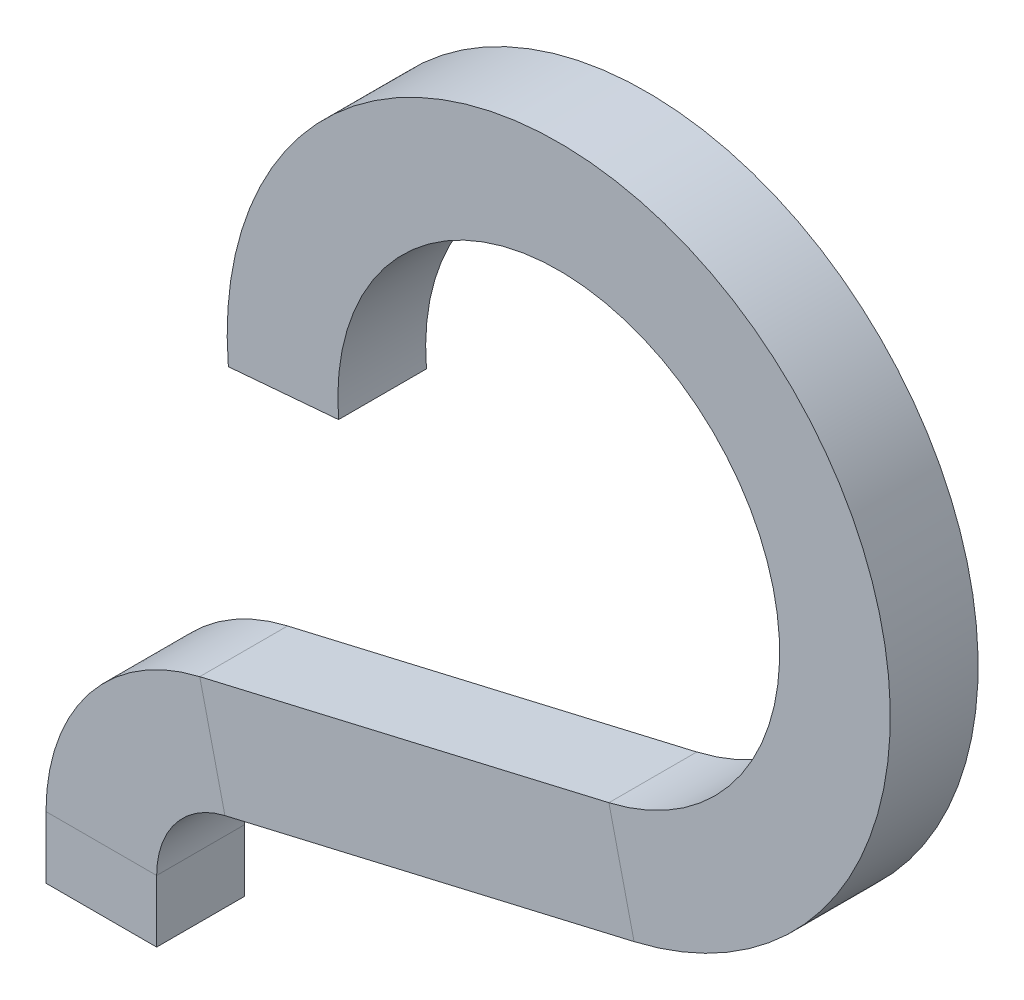
ISO-10303-21;
HEADER;
FILE_DESCRIPTION(('STEP AP214'),'2;1');
FILE_NAME('part.step','',(''),(''),'','','');
FILE_SCHEMA(('AUTOMOTIVE_DESIGN { 1 0 10303 214 1 1 1 1 }'));
ENDSEC;
DATA;
#1=APPLICATION_CONTEXT('core data for automotive mechanical design processes');
#2=APPLICATION_PROTOCOL_DEFINITION('international standard','automotive_design',2000,#1);
#3=PRODUCT_CONTEXT('',#1,'mechanical');
#4=PRODUCT('Part','Part','',(#3));
#5=PRODUCT_RELATED_PRODUCT_CATEGORY('part','',(#4));
#6=PRODUCT_DEFINITION_FORMATION('','',#4);
#7=PRODUCT_DEFINITION_CONTEXT('part definition',#1,'design');
#8=PRODUCT_DEFINITION('design','',#6,#7);
#9=PRODUCT_DEFINITION_SHAPE('','',#8);
#10=(LENGTH_UNIT() NAMED_UNIT(*) SI_UNIT(.MILLI.,.METRE.));
#11=(NAMED_UNIT(*) PLANE_ANGLE_UNIT() SI_UNIT($,.RADIAN.));
#12=(NAMED_UNIT(*) SI_UNIT($,.STERADIAN.) SOLID_ANGLE_UNIT());
#13=UNCERTAINTY_MEASURE_WITH_UNIT(LENGTH_MEASURE(1.E-05),#10,'distance_accuracy_value','');
#14=(GEOMETRIC_REPRESENTATION_CONTEXT(3) GLOBAL_UNCERTAINTY_ASSIGNED_CONTEXT((#13)) GLOBAL_UNIT_ASSIGNED_CONTEXT((#10,
#11,#12)) REPRESENTATION_CONTEXT('',''));
#15=CARTESIAN_POINT('',(0.,0.,0.));
#16=DIRECTION('',(0.,0.,1.));
#17=DIRECTION('',(1.,0.,0.));
#18=AXIS2_PLACEMENT_3D('',#15,#16,#17);
#19=CARTESIAN_POINT('',(-14.4458437154451,20.5388431687247,-14.1552166569552));
#20=DIRECTION('',(0.,0.,1.));
#21=DIRECTION('',(1.,0.,0.));
#22=AXIS2_PLACEMENT_3D('',#19,#20,#21);
#23=PLANE('',#22);
#24=DIRECTION('',(-1.,0.,0.));
#25=VECTOR('',#24,1.);
#26=CARTESIAN_POINT('',(-14.4458437154451,20.5388431687247,-14.1552166569552));
#27=LINE('',#26,#25);
#28=CARTESIAN_POINT('',(22.1689833705459,20.5388431687242,-14.1552166569552));
#29=VERTEX_POINT('',#28);
#30=CARTESIAN_POINT('',(-14.4458437154451,20.5388431687247,-14.1552166569552));
#31=VERTEX_POINT('',#30);
#32=EDGE_CURVE('E189',#29,#31,#27,.T.);
#33=ORIENTED_EDGE('',*,*,#32,.F.);
#34=DIRECTION('',(0.,-1.,0.));
#35=VECTOR('',#34,1.);
#36=CARTESIAN_POINT('',(22.1689833705459,20.5388431687242,-14.1552166569552));
#37=LINE('',#36,#35);
#38=CARTESIAN_POINT('',(22.1689833705459,-1.5404344466674E-12,-14.1552166569552));
#39=VERTEX_POINT('',#38);
#40=EDGE_CURVE('E42',#29,#39,#37,.T.);
#41=ORIENTED_EDGE('',*,*,#40,.T.);
#42=DIRECTION('',(-1.,0.,0.));
#43=VECTOR('',#42,1.);
#44=CARTESIAN_POINT('',(-14.4458437154451,-1.03389519168218E-12,-14.1552166569552));
#45=LINE('',#44,#43);
#46=CARTESIAN_POINT('',(-14.4458437154451,-1.03389519168218E-12,-14.1552166569552));
#47=VERTEX_POINT('',#46);
#48=EDGE_CURVE('E49',#39,#47,#45,.T.);
#49=ORIENTED_EDGE('',*,*,#48,.T.);
#50=DIRECTION('',(0.,-1.,0.));
#51=VECTOR('',#50,1.);
#52=CARTESIAN_POINT('',(-14.4458437154451,20.5388431687247,-14.1552166569552));
#53=LINE('',#52,#51);
#54=EDGE_CURVE('E11',#31,#47,#53,.T.);
#55=ORIENTED_EDGE('',*,*,#54,.F.);
#56=EDGE_LOOP('',(#33,#41,#49,#55));
#57=FACE_BOUND('',#56,.T.);
#58=ADVANCED_FACE('F35',(#57),#23,.F.);
#59=CARTESIAN_POINT('',(22.1689833705459,20.5388431687242,-14.1552166569552));
#60=DIRECTION('',(-1.,0.,0.));
#61=DIRECTION('',(0.,0.,1.));
#62=AXIS2_PLACEMENT_3D('',#59,#60,#61);
#63=PLANE('',#62);
#64=DIRECTION('',(0.,0.,-1.));
#65=VECTOR('',#64,1.);
#66=CARTESIAN_POINT('',(22.1689833705459,20.5388431687242,-14.1552166569552));
#67=LINE('',#66,#65);
#68=CARTESIAN_POINT('',(22.1689833705459,20.5388431687242,14.9101615453267));
#69=VERTEX_POINT('',#68);
#70=EDGE_CURVE('E186',#69,#29,#67,.T.);
#71=ORIENTED_EDGE('',*,*,#70,.F.);
#72=DIRECTION('',(0.,-1.,0.));
#73=VECTOR('',#72,1.);
#74=CARTESIAN_POINT('',(22.1689833705459,20.5388431687242,14.9101615453267));
#75=LINE('',#74,#73);
#76=CARTESIAN_POINT('',(22.1689833705459,-1.5404344466674E-12,14.9101615453267));
#77=VERTEX_POINT('',#76);
#78=EDGE_CURVE('E213',#69,#77,#75,.T.);
#79=ORIENTED_EDGE('',*,*,#78,.T.);
#80=DIRECTION('',(0.,0.,-1.));
#81=VECTOR('',#80,1.);
#82=CARTESIAN_POINT('',(22.1689833705459,-1.5404344466674E-12,-14.1552166569552));
#83=LINE('',#82,#81);
#84=EDGE_CURVE('E57',#77,#39,#83,.T.);
#85=ORIENTED_EDGE('',*,*,#84,.T.);
#86=ORIENTED_EDGE('',*,*,#40,.F.);
#87=EDGE_LOOP('',(#71,#79,#85,#86));
#88=FACE_BOUND('',#87,.T.);
#89=ADVANCED_FACE('F216',(#88),#63,.F.);
#90=CARTESIAN_POINT('',(-14.4458437154451,20.5388431687247,14.9101615453267));
#91=DIRECTION('',(0.,0.,-1.));
#92=DIRECTION('',(-1.,0.,0.));
#93=AXIS2_PLACEMENT_3D('',#90,#91,#92);
#94=PLANE('',#93);
#95=DIRECTION('',(1.,0.,0.));
#96=VECTOR('',#95,1.);
#97=CARTESIAN_POINT('',(-14.4458437154451,20.5388431687247,14.9101615453267));
#98=LINE('',#97,#96);
#99=CARTESIAN_POINT('',(-14.4458437154451,20.5388431687247,14.9101615453267));
#100=VERTEX_POINT('',#99);
#101=EDGE_CURVE('E183',#100,#69,#98,.T.);
#102=ORIENTED_EDGE('',*,*,#101,.F.);
#103=DIRECTION('',(0.,-1.,0.));
#104=VECTOR('',#103,1.);
#105=CARTESIAN_POINT('',(-14.4458437154451,20.5388431687247,14.9101615453267));
#106=LINE('',#105,#104);
#107=CARTESIAN_POINT('',(-14.4458437154451,-1.03389519168218E-12,14.9101615453267));
#108=VERTEX_POINT('',#107);
#109=EDGE_CURVE('E210',#100,#108,#106,.T.);
#110=ORIENTED_EDGE('',*,*,#109,.T.);
#111=DIRECTION('',(1.,0.,0.));
#112=VECTOR('',#111,1.);
#113=CARTESIAN_POINT('',(-14.4458437154451,-1.03389519168218E-12,14.9101615453267));
#114=LINE('',#113,#112);
#115=EDGE_CURVE('E206',#108,#77,#114,.T.);
#116=ORIENTED_EDGE('',*,*,#115,.T.);
#117=ORIENTED_EDGE('',*,*,#78,.F.);
#118=EDGE_LOOP('',(#102,#110,#116,#117));
#119=FACE_BOUND('',#118,.T.);
#120=ADVANCED_FACE('F257',(#119),#94,.F.);
#121=CARTESIAN_POINT('',(-14.4458437154451,20.5388431687247,-14.1552166569552));
#122=DIRECTION('',(1.,0.,0.));
#123=DIRECTION('',(0.,0.,-1.));
#124=AXIS2_PLACEMENT_3D('',#121,#122,#123);
#125=PLANE('',#124);
#126=DIRECTION('',(0.,0.,1.));
#127=VECTOR('',#126,1.);
#128=CARTESIAN_POINT('',(-14.4458437154451,20.5388431687247,-14.1552166569552));
#129=LINE('',#128,#127);
#130=EDGE_CURVE('E180',#31,#100,#129,.T.);
#131=ORIENTED_EDGE('',*,*,#130,.F.);
#132=ORIENTED_EDGE('',*,*,#54,.T.);
#133=DIRECTION('',(0.,0.,1.));
#134=VECTOR('',#133,1.);
#135=CARTESIAN_POINT('',(-14.4458437154451,-1.03389519168218E-12,-14.1552166569552));
#136=LINE('',#135,#134);
#137=EDGE_CURVE('E204',#47,#108,#136,.T.);
#138=ORIENTED_EDGE('',*,*,#137,.T.);
#139=ORIENTED_EDGE('',*,*,#109,.F.);
#140=EDGE_LOOP('',(#131,#132,#138,#139));
#141=FACE_BOUND('',#140,.T.);
#142=ADVANCED_FACE('F247',(#141),#125,.F.);
#143=CARTESIAN_POINT('',(36.4419185296101,84.6587679085149,-14.1552166569552));
#144=DIRECTION('',(0.,0.,1.));
#145=DIRECTION('',(1.,0.,0.));
#146=AXIS2_PLACEMENT_3D('',#143,#144,#145);
#147=PLANE('',#146);
#148=DIRECTION('',(-0.227102895846886,0.973870768992457,0.));
#149=VECTOR('',#148,1.);
#150=CARTESIAN_POINT('',(36.4419185296101,84.6587679085149,-14.1552166569552));
#151=LINE('',#150,#149);
#152=CARTESIAN_POINT('',(44.7572517917716,49.0006580977551,-14.1552166569552));
#153=VERTEX_POINT('',#152);
#154=CARTESIAN_POINT('',(36.4419185296101,84.6587679085149,-14.1552166569552));
#155=VERTEX_POINT('',#154);
#156=EDGE_CURVE('E165',#153,#155,#151,.T.);
#157=ORIENTED_EDGE('',*,*,#156,.F.);
#158=CARTESIAN_POINT('',(51.3944369268485,20.5388431687257,-14.1552166569552));
#159=DIRECTION('',(0.,0.,1.));
#160=DIRECTION('',(1.,0.,0.));
#161=AXIS2_PLACEMENT_3D('',#158,#159,#160);
#162=CIRCLE('',#161,29.2254535563026);
#163=EDGE_CURVE('E198',#153,#29,#162,.T.);
#164=ORIENTED_EDGE('',*,*,#163,.T.);
#165=ORIENTED_EDGE('',*,*,#32,.T.);
#166=CARTESIAN_POINT('',(51.3944369268485,20.5388431687257,-14.1552166569552));
#167=DIRECTION('',(0.,0.,1.));
#168=DIRECTION('',(1.,0.,0.));
#169=AXIS2_PLACEMENT_3D('',#166,#167,#168);
#170=CIRCLE('',#169,65.8402806422936);
#171=EDGE_CURVE('E201',#155,#31,#170,.T.);
#172=ORIENTED_EDGE('',*,*,#171,.F.);
#173=EDGE_LOOP('',(#157,#164,#165,#172));
#174=FACE_BOUND('',#173,.T.);
#175=ADVANCED_FACE('F249',(#174),#147,.F.);
#176=CARTESIAN_POINT('',(51.3944369268485,20.5388431687257,0.));
#177=DIRECTION('',(0.,0.,1.));
#178=DIRECTION('',(1.,0.,0.));
#179=AXIS2_PLACEMENT_3D('',#176,#177,#178);
#180=CYLINDRICAL_SURFACE('',#179,29.2254535563026);
#181=DIRECTION('',(0.,0.,-1.));
#182=VECTOR('',#181,1.);
#183=CARTESIAN_POINT('',(44.7572517917716,49.0006580977551,-14.1552166569552));
#184=LINE('',#183,#182);
#185=CARTESIAN_POINT('',(44.7572517917716,49.0006580977551,14.9101615453267));
#186=VERTEX_POINT('',#185);
#187=EDGE_CURVE('E162',#186,#153,#184,.T.);
#188=ORIENTED_EDGE('',*,*,#187,.F.);
#189=CARTESIAN_POINT('',(51.3944369268485,20.5388431687257,14.9101615453267));
#190=DIRECTION('',(0.,0.,1.));
#191=DIRECTION('',(1.,0.,0.));
#192=AXIS2_PLACEMENT_3D('',#189,#190,#191);
#193=CIRCLE('',#192,29.2254535563026);
#194=EDGE_CURVE('E195',#186,#69,#193,.T.);
#195=ORIENTED_EDGE('',*,*,#194,.T.);
#196=ORIENTED_EDGE('',*,*,#70,.T.);
#197=ORIENTED_EDGE('',*,*,#163,.F.);
#198=EDGE_LOOP('',(#188,#195,#196,#197));
#199=FACE_BOUND('',#198,.T.);
#200=ADVANCED_FACE('F224',(#199),#180,.F.);
#201=CARTESIAN_POINT('',(36.4419185296101,84.6587679085149,14.9101615453267));
#202=DIRECTION('',(0.,0.,-1.));
#203=DIRECTION('',(-1.,0.,0.));
#204=AXIS2_PLACEMENT_3D('',#201,#202,#203);
#205=PLANE('',#204);
#206=DIRECTION('',(0.227102895846886,-0.973870768992457,0.));
#207=VECTOR('',#206,1.);
#208=CARTESIAN_POINT('',(36.4419185296101,84.6587679085149,14.9101615453267));
#209=LINE('',#208,#207);
#210=CARTESIAN_POINT('',(36.4419185296101,84.6587679085149,14.9101615453267));
#211=VERTEX_POINT('',#210);
#212=EDGE_CURVE('E159',#211,#186,#209,.T.);
#213=ORIENTED_EDGE('',*,*,#212,.F.);
#214=CARTESIAN_POINT('',(51.3944369268485,20.5388431687257,14.9101615453267));
#215=DIRECTION('',(0.,0.,1.));
#216=DIRECTION('',(1.,0.,0.));
#217=AXIS2_PLACEMENT_3D('',#214,#215,#216);
#218=CIRCLE('',#217,65.8402806422936);
#219=EDGE_CURVE('E192',#211,#100,#218,.T.);
#220=ORIENTED_EDGE('',*,*,#219,.T.);
#221=ORIENTED_EDGE('',*,*,#101,.T.);
#222=ORIENTED_EDGE('',*,*,#194,.F.);
#223=EDGE_LOOP('',(#213,#220,#221,#222));
#224=FACE_BOUND('',#223,.T.);
#225=ADVANCED_FACE('F221',(#224),#205,.F.);
#226=CARTESIAN_POINT('',(51.3944369268485,20.5388431687257,0.));
#227=DIRECTION('',(0.,0.,1.));
#228=DIRECTION('',(1.,0.,0.));
#229=AXIS2_PLACEMENT_3D('',#226,#227,#228);
#230=CYLINDRICAL_SURFACE('',#229,65.8402806422936);
#231=DIRECTION('',(0.,0.,1.));
#232=VECTOR('',#231,1.);
#233=CARTESIAN_POINT('',(36.4419185296101,84.6587679085149,-14.1552166569552));
#234=LINE('',#233,#232);
#235=EDGE_CURVE('E124',#155,#211,#234,.T.);
#236=ORIENTED_EDGE('',*,*,#235,.F.);
#237=ORIENTED_EDGE('',*,*,#171,.T.);
#238=ORIENTED_EDGE('',*,*,#130,.T.);
#239=ORIENTED_EDGE('',*,*,#219,.F.);
#240=EDGE_LOOP('',(#236,#237,#238,#239));
#241=FACE_BOUND('',#240,.T.);
#242=ADVANCED_FACE('F244',(#241),#230,.T.);
#243=CARTESIAN_POINT('',(171.845234240797,116.234297315868,-14.1552166569552));
#244=DIRECTION('',(0.,0.,1.));
#245=DIRECTION('',(1.,0.,0.));
#246=AXIS2_PLACEMENT_3D('',#243,#244,#245);
#247=PLANE('',#246);
#248=DIRECTION('',(-0.227102895846886,0.973870768992457,0.));
#249=VECTOR('',#248,1.);
#250=CARTESIAN_POINT('',(171.845234240797,116.234297315868,-14.1552166569552));
#251=LINE('',#250,#249);
#252=CARTESIAN_POINT('',(180.160567502959,80.576187505108,-14.1552166569552));
#253=VERTEX_POINT('',#252);
#254=CARTESIAN_POINT('',(171.845234240797,116.234297315868,-14.1552166569552));
#255=VERTEX_POINT('',#254);
#256=EDGE_CURVE('E149',#253,#255,#251,.T.);
#257=ORIENTED_EDGE('',*,*,#256,.F.);
#258=DIRECTION('',(-0.973870768992453,-0.2271028958469,0.));
#259=VECTOR('',#258,1.);
#260=CARTESIAN_POINT('',(180.160567502959,80.576187505108,-14.1552166569552));
#261=LINE('',#260,#259);
#262=EDGE_CURVE('E174',#253,#153,#261,.T.);
#263=ORIENTED_EDGE('',*,*,#262,.T.);
#264=ORIENTED_EDGE('',*,*,#156,.T.);
#265=DIRECTION('',(-0.973870768992453,-0.2271028958469,0.));
#266=VECTOR('',#265,1.);
#267=CARTESIAN_POINT('',(171.845234240797,116.234297315868,-14.1552166569552));
#268=LINE('',#267,#266);
#269=EDGE_CURVE('E177',#255,#155,#268,.T.);
#270=ORIENTED_EDGE('',*,*,#269,.F.);
#271=EDGE_LOOP('',(#257,#263,#264,#270));
#272=FACE_BOUND('',#271,.T.);
#273=ADVANCED_FACE('F239',(#272),#247,.F.);
#274=CARTESIAN_POINT('',(180.160567502959,80.576187505108,-14.1552166569552));
#275=DIRECTION('',(-0.2271028958469,0.973870768992453,0.));
#276=DIRECTION('',(-0.973870768992453,-0.2271028958469,0.));
#277=AXIS2_PLACEMENT_3D('',#274,#275,#276);
#278=PLANE('',#277);
#279=DIRECTION('',(0.,0.,-1.));
#280=VECTOR('',#279,1.);
#281=CARTESIAN_POINT('',(180.160567502959,80.576187505108,-14.1552166569552));
#282=LINE('',#281,#280);
#283=CARTESIAN_POINT('',(180.160567502959,80.576187505108,14.9101615453267));
#284=VERTEX_POINT('',#283);
#285=EDGE_CURVE('E146',#284,#253,#282,.T.);
#286=ORIENTED_EDGE('',*,*,#285,.F.);
#287=DIRECTION('',(-0.973870768992453,-0.2271028958469,0.));
#288=VECTOR('',#287,1.);
#289=CARTESIAN_POINT('',(180.160567502959,80.576187505108,14.9101615453267));
#290=LINE('',#289,#288);
#291=EDGE_CURVE('E171',#284,#186,#290,.T.);
#292=ORIENTED_EDGE('',*,*,#291,.T.);
#293=ORIENTED_EDGE('',*,*,#187,.T.);
#294=ORIENTED_EDGE('',*,*,#262,.F.);
#295=EDGE_LOOP('',(#286,#292,#293,#294));
#296=FACE_BOUND('',#295,.T.);
#297=ADVANCED_FACE('F231',(#296),#278,.F.);
#298=CARTESIAN_POINT('',(171.845234240797,116.234297315868,14.9101615453267));
#299=DIRECTION('',(0.,0.,-1.));
#300=DIRECTION('',(-1.,0.,0.));
#301=AXIS2_PLACEMENT_3D('',#298,#299,#300);
#302=PLANE('',#301);
#303=DIRECTION('',(0.227102895846886,-0.973870768992457,0.));
#304=VECTOR('',#303,1.);
#305=CARTESIAN_POINT('',(171.845234240797,116.234297315868,14.9101615453267));
#306=LINE('',#305,#304);
#307=CARTESIAN_POINT('',(171.845234240797,116.234297315868,14.9101615453267));
#308=VERTEX_POINT('',#307);
#309=EDGE_CURVE('E144',#308,#284,#306,.T.);
#310=ORIENTED_EDGE('',*,*,#309,.F.);
#311=DIRECTION('',(-0.973870768992453,-0.2271028958469,0.));
#312=VECTOR('',#311,1.);
#313=CARTESIAN_POINT('',(171.845234240797,116.234297315868,14.9101615453267));
#314=LINE('',#313,#312);
#315=EDGE_CURVE('E168',#308,#211,#314,.T.);
#316=ORIENTED_EDGE('',*,*,#315,.T.);
#317=ORIENTED_EDGE('',*,*,#212,.T.);
#318=ORIENTED_EDGE('',*,*,#291,.F.);
#319=EDGE_LOOP('',(#310,#316,#317,#318));
#320=FACE_BOUND('',#319,.T.);
#321=ADVANCED_FACE('F229',(#320),#302,.F.);
#322=CARTESIAN_POINT('',(171.845234240797,116.234297315868,-14.1552166569552));
#323=DIRECTION('',(0.2271028958469,-0.973870768992453,0.));
#324=DIRECTION('',(0.973870768992453,0.2271028958469,0.));
#325=AXIS2_PLACEMENT_3D('',#322,#323,#324);
#326=PLANE('',#325);
#327=DIRECTION('',(0.,0.,1.));
#328=VECTOR('',#327,1.);
#329=CARTESIAN_POINT('',(171.845234240797,116.234297315868,-14.1552166569552));
#330=LINE('',#329,#328);
#331=EDGE_CURVE('E120',#255,#308,#330,.T.);
#332=ORIENTED_EDGE('',*,*,#331,.F.);
#333=ORIENTED_EDGE('',*,*,#269,.T.);
#334=ORIENTED_EDGE('',*,*,#235,.T.);
#335=ORIENTED_EDGE('',*,*,#315,.F.);
#336=EDGE_LOOP('',(#332,#333,#334,#335));
#337=FACE_BOUND('',#336,.T.);
#338=ADVANCED_FACE('F241',(#337),#326,.F.);
#339=CARTESIAN_POINT('',(155.240799212474,187.438030097066,0.));
#340=DIRECTION('',(0.,0.,1.));
#341=DIRECTION('',(1.,0.,0.));
#342=AXIS2_PLACEMENT_3D('',#339,#340,#341);
#343=CYLINDRICAL_SURFACE('',#342,73.1141492775928);
#344=CARTESIAN_POINT('',(155.240799212474,187.438030097066,14.9101615453267));
#345=DIRECTION('',(0.,0.,1.));
#346=DIRECTION('',(1.,0.,0.));
#347=AXIS2_PLACEMENT_3D('',#344,#345,#346);
#348=CIRCLE('',#347,73.1141492775928);
#349=CARTESIAN_POINT('',(82.3852741083671,181.293822549228,14.9101615453267));
#350=VERTEX_POINT('',#349);
#351=EDGE_CURVE('E113',#308,#350,#348,.T.);
#352=ORIENTED_EDGE('',*,*,#351,.T.);
#353=DIRECTION('',(0.,0.,1.));
#354=VECTOR('',#353,1.);
#355=CARTESIAN_POINT('',(82.3852741083671,181.293822549228,-14.1552166569552));
#356=LINE('',#355,#354);
#357=CARTESIAN_POINT('',(82.3852741083671,181.293822549228,-14.1552166569552));
#358=VERTEX_POINT('',#357);
#359=EDGE_CURVE('E117',#358,#350,#356,.T.);
#360=ORIENTED_EDGE('',*,*,#359,.F.);
#361=CARTESIAN_POINT('',(155.240799212474,187.438030097066,-14.1552166569552));
#362=DIRECTION('',(0.,0.,1.));
#363=DIRECTION('',(1.,0.,0.));
#364=AXIS2_PLACEMENT_3D('',#361,#362,#363);
#365=CIRCLE('',#364,73.1141492775928);
#366=EDGE_CURVE('E152',#255,#358,#365,.T.);
#367=ORIENTED_EDGE('',*,*,#366,.F.);
#368=ORIENTED_EDGE('',*,*,#331,.T.);
#369=EDGE_LOOP('',(#352,#360,#367,#368));
#370=FACE_BOUND('',#369,.T.);
#371=ADVANCED_FACE('F115',(#370),#343,.F.);
#372=CARTESIAN_POINT('',(171.845234240797,116.234297315868,14.9101615453267));
#373=DIRECTION('',(0.,0.,1.));
#374=DIRECTION('',(1.,0.,0.));
#375=AXIS2_PLACEMENT_3D('',#372,#373,#374);
#376=PLANE('',#375);
#377=CARTESIAN_POINT('',(155.240799212474,187.438030097066,14.9101615453267));
#378=DIRECTION('',(0.,0.,1.));
#379=DIRECTION('',(1.,0.,0.));
#380=AXIS2_PLACEMENT_3D('',#377,#378,#379);
#381=CIRCLE('',#380,109.728976363584);
#382=CARTESIAN_POINT('',(45.8999633948702,178.216865501005,14.9101615453267));
#383=VERTEX_POINT('',#382);
#384=EDGE_CURVE('E125',#284,#383,#381,.T.);
#385=ORIENTED_EDGE('',*,*,#384,.T.);
#386=DIRECTION('',(-0.996462734285486,-0.084035820816438,0.));
#387=VECTOR('',#386,1.);
#388=CARTESIAN_POINT('',(82.3852741083671,181.293822549228,14.9101615453267));
#389=LINE('',#388,#387);
#390=EDGE_CURVE('E131',#350,#383,#389,.T.);
#391=ORIENTED_EDGE('',*,*,#390,.F.);
#392=ORIENTED_EDGE('',*,*,#351,.F.);
#393=ORIENTED_EDGE('',*,*,#309,.T.);
#394=EDGE_LOOP('',(#385,#391,#392,#393));
#395=FACE_BOUND('',#394,.T.);
#396=ADVANCED_FACE('F136',(#395),#376,.T.);
#397=CARTESIAN_POINT('',(155.240799212474,187.438030097066,0.));
#398=DIRECTION('',(0.,0.,1.));
#399=DIRECTION('',(1.,0.,0.));
#400=AXIS2_PLACEMENT_3D('',#397,#398,#399);
#401=CYLINDRICAL_SURFACE('',#400,109.728976363584);
#402=CARTESIAN_POINT('',(155.240799212474,187.438030097066,-14.1552166569552));
#403=DIRECTION('',(0.,0.,1.));
#404=DIRECTION('',(1.,0.,0.));
#405=AXIS2_PLACEMENT_3D('',#402,#403,#404);
#406=CIRCLE('',#405,109.728976363584);
#407=CARTESIAN_POINT('',(45.8999633948702,178.216865501005,-14.1552166569552));
#408=VERTEX_POINT('',#407);
#409=EDGE_CURVE('E154',#253,#408,#406,.T.);
#410=ORIENTED_EDGE('',*,*,#409,.T.);
#411=DIRECTION('',(0.,0.,-1.));
#412=VECTOR('',#411,1.);
#413=CARTESIAN_POINT('',(45.8999633948702,178.216865501005,-14.1552166569552));
#414=LINE('',#413,#412);
#415=EDGE_CURVE('E138',#383,#408,#414,.T.);
#416=ORIENTED_EDGE('',*,*,#415,.F.);
#417=ORIENTED_EDGE('',*,*,#384,.F.);
#418=ORIENTED_EDGE('',*,*,#285,.T.);
#419=EDGE_LOOP('',(#410,#416,#417,#418));
#420=FACE_BOUND('',#419,.T.);
#421=ADVANCED_FACE('F234',(#420),#401,.T.);
#422=CARTESIAN_POINT('',(171.845234240797,116.234297315868,-14.1552166569552));
#423=DIRECTION('',(0.,0.,-1.));
#424=DIRECTION('',(-1.,0.,0.));
#425=AXIS2_PLACEMENT_3D('',#422,#423,#424);
#426=PLANE('',#425);
#427=ORIENTED_EDGE('',*,*,#256,.T.);
#428=ORIENTED_EDGE('',*,*,#366,.T.);
#429=DIRECTION('',(0.996462734285486,0.084035820816438,0.));
#430=VECTOR('',#429,1.);
#431=CARTESIAN_POINT('',(82.3852741083671,181.293822549228,-14.1552166569552));
#432=LINE('',#431,#430);
#433=EDGE_CURVE('E134',#408,#358,#432,.T.);
#434=ORIENTED_EDGE('',*,*,#433,.F.);
#435=ORIENTED_EDGE('',*,*,#409,.F.);
#436=EDGE_LOOP('',(#427,#428,#434,#435));
#437=FACE_BOUND('',#436,.T.);
#438=ADVANCED_FACE('F237',(#437),#426,.T.);
#439=CARTESIAN_POINT('',(82.8831869743117,-2.42861286636753E-12,0.));
#440=DIRECTION('',(0.,1.,0.));
#441=DIRECTION('',(-1.,0.,0.));
#442=AXIS2_PLACEMENT_3D('',#439,#440,#441);
#443=PLANE('',#442);
#444=ORIENTED_EDGE('',*,*,#137,.F.);
#445=ORIENTED_EDGE('',*,*,#48,.F.);
#446=ORIENTED_EDGE('',*,*,#84,.F.);
#447=ORIENTED_EDGE('',*,*,#115,.F.);
#448=EDGE_LOOP('',(#444,#445,#446,#447));
#449=FACE_BOUND('',#448,.T.);
#450=ADVANCED_FACE('F364',(#449),#443,.F.);
#451=CARTESIAN_POINT('',(-14.599477938104,173.114697565946,0.));
#452=DIRECTION('',(0.084035820816438,-0.996462734285486,0.));
#453=DIRECTION('',(0.996462734285486,0.084035820816438,0.));
#454=AXIS2_PLACEMENT_3D('',#451,#452,#453);
#455=PLANE('',#454);
#456=ORIENTED_EDGE('',*,*,#359,.T.);
#457=ORIENTED_EDGE('',*,*,#390,.T.);
#458=ORIENTED_EDGE('',*,*,#415,.T.);
#459=ORIENTED_EDGE('',*,*,#433,.T.);
#460=EDGE_LOOP('',(#456,#457,#458,#459));
#461=FACE_BOUND('',#460,.T.);
#462=ADVANCED_FACE('F129',(#461),#455,.T.);
#463=CLOSED_SHELL('',(#58,#89,#120,#142,#175,#200,#225,#242,#273,#297,#321,#338,#371,#396,#421,
#438,#450,#462));
#464=MANIFOLD_SOLID_BREP('B2',#463);
#465=ADVANCED_BREP_SHAPE_REPRESENTATION('',(#18,#464),#14);
#466=SHAPE_DEFINITION_REPRESENTATION(#9,#465);
ENDSEC;
END-ISO-10303-21;
